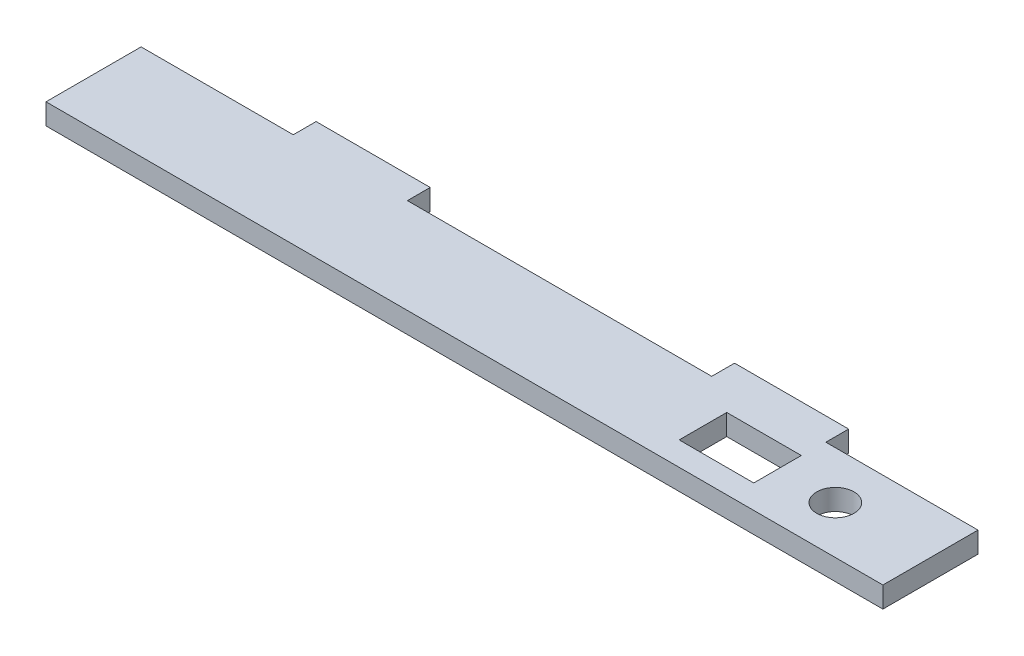
ISO-10303-21;
HEADER;
FILE_DESCRIPTION(('STEP AP214'),'2;1');
FILE_NAME('part.step','',(''),(''),'','','');
FILE_SCHEMA(('AUTOMOTIVE_DESIGN { 1 0 10303 214 1 1 1 1 }'));
ENDSEC;
DATA;
#1=APPLICATION_CONTEXT('core data for automotive mechanical design processes');
#2=APPLICATION_PROTOCOL_DEFINITION('international standard','automotive_design',2000,#1);
#3=PRODUCT_CONTEXT('',#1,'mechanical');
#4=PRODUCT('Part','Part','',(#3));
#5=PRODUCT_RELATED_PRODUCT_CATEGORY('part','',(#4));
#6=PRODUCT_DEFINITION_FORMATION('','',#4);
#7=PRODUCT_DEFINITION_CONTEXT('part definition',#1,'design');
#8=PRODUCT_DEFINITION('design','',#6,#7);
#9=PRODUCT_DEFINITION_SHAPE('','',#8);
#10=(LENGTH_UNIT() NAMED_UNIT(*) SI_UNIT(.MILLI.,.METRE.));
#11=(NAMED_UNIT(*) PLANE_ANGLE_UNIT() SI_UNIT($,.RADIAN.));
#12=(NAMED_UNIT(*) SI_UNIT($,.STERADIAN.) SOLID_ANGLE_UNIT());
#13=UNCERTAINTY_MEASURE_WITH_UNIT(LENGTH_MEASURE(1.E-05),#10,'distance_accuracy_value','');
#14=(GEOMETRIC_REPRESENTATION_CONTEXT(3) GLOBAL_UNCERTAINTY_ASSIGNED_CONTEXT((#13)) GLOBAL_UNIT_ASSIGNED_CONTEXT((#10,
#11,#12)) REPRESENTATION_CONTEXT('',''));
#15=CARTESIAN_POINT('',(0.,0.,0.));
#16=DIRECTION('',(0.,0.,1.));
#17=DIRECTION('',(1.,0.,0.));
#18=AXIS2_PLACEMENT_3D('',#15,#16,#17);
#19=CARTESIAN_POINT('',(-70.,5.5,0.));
#20=DIRECTION('',(-1.,0.,0.));
#21=DIRECTION('',(0.,0.,1.));
#22=AXIS2_PLACEMENT_3D('',#19,#20,#21);
#23=PLANE('',#22);
#24=DIRECTION('',(0.,0.,-1.));
#25=VECTOR('',#24,1.);
#26=CARTESIAN_POINT('',(-70.,0.,0.));
#27=LINE('',#26,#25);
#28=CARTESIAN_POINT('',(-70.,0.,-12.5000000000001));
#29=VERTEX_POINT('',#28);
#30=CARTESIAN_POINT('',(-70.,0.,-18.5000000000001));
#31=VERTEX_POINT('',#30);
#32=EDGE_CURVE('E194',#29,#31,#27,.T.);
#33=ORIENTED_EDGE('',*,*,#32,.F.);
#34=DIRECTION('',(0.,-1.,0.));
#35=VECTOR('',#34,1.);
#36=CARTESIAN_POINT('',(-70.,5.5,-12.5000000000001));
#37=LINE('',#36,#35);
#38=CARTESIAN_POINT('',(-70.,5.5,-12.5000000000001));
#39=VERTEX_POINT('',#38);
#40=EDGE_CURVE('E11',#39,#29,#37,.T.);
#41=ORIENTED_EDGE('',*,*,#40,.F.);
#42=DIRECTION('',(0.,0.,-1.));
#43=VECTOR('',#42,1.);
#44=CARTESIAN_POINT('',(-70.,5.5,0.));
#45=LINE('',#44,#43);
#46=CARTESIAN_POINT('',(-70.,5.5,-18.5000000000001));
#47=VERTEX_POINT('',#46);
#48=EDGE_CURVE('E207',#39,#47,#45,.T.);
#49=ORIENTED_EDGE('',*,*,#48,.T.);
#50=DIRECTION('',(0.,-1.,0.));
#51=VECTOR('',#50,1.);
#52=CARTESIAN_POINT('',(-70.,5.5,-18.5000000000001));
#53=LINE('',#52,#51);
#54=EDGE_CURVE('E245',#47,#31,#53,.T.);
#55=ORIENTED_EDGE('',*,*,#54,.T.);
#56=EDGE_LOOP('',(#33,#41,#49,#55));
#57=FACE_BOUND('',#56,.T.);
#58=ADVANCED_FACE('F38',(#57),#23,.T.);
#59=CARTESIAN_POINT('',(0.,5.5,-12.5000000000001));
#60=DIRECTION('',(0.,0.,-1.));
#61=DIRECTION('',(-1.,0.,0.));
#62=AXIS2_PLACEMENT_3D('',#59,#60,#61);
#63=PLANE('',#62);
#64=DIRECTION('',(1.,0.,0.));
#65=VECTOR('',#64,1.);
#66=CARTESIAN_POINT('',(0.,0.,-12.5000000000001));
#67=LINE('',#66,#65);
#68=CARTESIAN_POINT('',(-110.,0.,-12.5000000000001));
#69=VERTEX_POINT('',#68);
#70=EDGE_CURVE('E249',#69,#29,#67,.T.);
#71=ORIENTED_EDGE('',*,*,#70,.F.);
#72=DIRECTION('',(0.,-1.,0.));
#73=VECTOR('',#72,1.);
#74=CARTESIAN_POINT('',(-110.,5.5,-12.5000000000001));
#75=LINE('',#74,#73);
#76=CARTESIAN_POINT('',(-110.,5.5,-12.5000000000001));
#77=VERTEX_POINT('',#76);
#78=EDGE_CURVE('E46',#77,#69,#75,.T.);
#79=ORIENTED_EDGE('',*,*,#78,.F.);
#80=DIRECTION('',(1.,0.,0.));
#81=VECTOR('',#80,1.);
#82=CARTESIAN_POINT('',(0.,5.5,-12.5000000000001));
#83=LINE('',#82,#81);
#84=EDGE_CURVE('E211',#77,#39,#83,.T.);
#85=ORIENTED_EDGE('',*,*,#84,.T.);
#86=ORIENTED_EDGE('',*,*,#40,.T.);
#87=EDGE_LOOP('',(#71,#79,#85,#86));
#88=FACE_BOUND('',#87,.T.);
#89=ADVANCED_FACE('F322',(#88),#63,.T.);
#90=CARTESIAN_POINT('',(-110.,5.5,0.));
#91=DIRECTION('',(-1.,0.,0.));
#92=DIRECTION('',(0.,0.,1.));
#93=AXIS2_PLACEMENT_3D('',#90,#91,#92);
#94=PLANE('',#93);
#95=DIRECTION('',(0.,0.,-1.));
#96=VECTOR('',#95,1.);
#97=CARTESIAN_POINT('',(-110.,0.,0.));
#98=LINE('',#97,#96);
#99=CARTESIAN_POINT('',(-110.,0.,12.4999999999999));
#100=VERTEX_POINT('',#99);
#101=EDGE_CURVE('E253',#100,#69,#98,.T.);
#102=ORIENTED_EDGE('',*,*,#101,.F.);
#103=DIRECTION('',(0.,-1.,0.));
#104=VECTOR('',#103,1.);
#105=CARTESIAN_POINT('',(-110.,5.5,12.4999999999999));
#106=LINE('',#105,#104);
#107=CARTESIAN_POINT('',(-110.,5.5,12.4999999999999));
#108=VERTEX_POINT('',#107);
#109=EDGE_CURVE('E312',#108,#100,#106,.T.);
#110=ORIENTED_EDGE('',*,*,#109,.F.);
#111=DIRECTION('',(0.,0.,-1.));
#112=VECTOR('',#111,1.);
#113=CARTESIAN_POINT('',(-110.,5.5,0.));
#114=LINE('',#113,#112);
#115=EDGE_CURVE('E216',#108,#77,#114,.T.);
#116=ORIENTED_EDGE('',*,*,#115,.T.);
#117=ORIENTED_EDGE('',*,*,#78,.T.);
#118=EDGE_LOOP('',(#102,#110,#116,#117));
#119=FACE_BOUND('',#118,.T.);
#120=ADVANCED_FACE('F318',(#119),#94,.T.);
#121=CARTESIAN_POINT('',(0.,5.5,12.4999999999999));
#122=DIRECTION('',(0.,0.,-1.));
#123=DIRECTION('',(-1.,0.,0.));
#124=AXIS2_PLACEMENT_3D('',#121,#122,#123);
#125=PLANE('',#124);
#126=DIRECTION('',(1.,0.,0.));
#127=VECTOR('',#126,1.);
#128=CARTESIAN_POINT('',(0.,0.,12.4999999999999));
#129=LINE('',#128,#127);
#130=CARTESIAN_POINT('',(110.000000000001,0.,12.4999999999999));
#131=VERTEX_POINT('',#130);
#132=EDGE_CURVE('E259',#100,#131,#129,.T.);
#133=ORIENTED_EDGE('',*,*,#132,.T.);
#134=DIRECTION('',(0.,-1.,0.));
#135=VECTOR('',#134,1.);
#136=CARTESIAN_POINT('',(110.000000000001,5.5,12.4999999999999));
#137=LINE('',#136,#135);
#138=CARTESIAN_POINT('',(110.000000000001,5.5,12.4999999999999));
#139=VERTEX_POINT('',#138);
#140=EDGE_CURVE('E308',#139,#131,#137,.T.);
#141=ORIENTED_EDGE('',*,*,#140,.F.);
#142=DIRECTION('',(1.,0.,0.));
#143=VECTOR('',#142,1.);
#144=CARTESIAN_POINT('',(0.,5.5,12.4999999999999));
#145=LINE('',#144,#143);
#146=EDGE_CURVE('E222',#108,#139,#145,.T.);
#147=ORIENTED_EDGE('',*,*,#146,.F.);
#148=ORIENTED_EDGE('',*,*,#109,.T.);
#149=EDGE_LOOP('',(#133,#141,#147,#148));
#150=FACE_BOUND('',#149,.T.);
#151=ADVANCED_FACE('F330',(#150),#125,.F.);
#152=CARTESIAN_POINT('',(110.000000000001,5.5,0.));
#153=DIRECTION('',(-1.,0.,0.));
#154=DIRECTION('',(0.,0.,1.));
#155=AXIS2_PLACEMENT_3D('',#152,#153,#154);
#156=PLANE('',#155);
#157=DIRECTION('',(0.,0.,-1.));
#158=VECTOR('',#157,1.);
#159=CARTESIAN_POINT('',(110.000000000001,0.,0.));
#160=LINE('',#159,#158);
#161=CARTESIAN_POINT('',(110.000000000001,0.,-12.5000000000001));
#162=VERTEX_POINT('',#161);
#163=EDGE_CURVE('E262',#131,#162,#160,.T.);
#164=ORIENTED_EDGE('',*,*,#163,.T.);
#165=DIRECTION('',(0.,-1.,0.));
#166=VECTOR('',#165,1.);
#167=CARTESIAN_POINT('',(110.000000000001,5.5,-12.5000000000001));
#168=LINE('',#167,#166);
#169=CARTESIAN_POINT('',(110.000000000001,5.5,-12.5000000000001));
#170=VERTEX_POINT('',#169);
#171=EDGE_CURVE('E305',#170,#162,#168,.T.);
#172=ORIENTED_EDGE('',*,*,#171,.F.);
#173=DIRECTION('',(0.,0.,-1.));
#174=VECTOR('',#173,1.);
#175=CARTESIAN_POINT('',(110.000000000001,5.5,0.));
#176=LINE('',#175,#174);
#177=EDGE_CURVE('E225',#139,#170,#176,.T.);
#178=ORIENTED_EDGE('',*,*,#177,.F.);
#179=ORIENTED_EDGE('',*,*,#140,.T.);
#180=EDGE_LOOP('',(#164,#172,#178,#179));
#181=FACE_BOUND('',#180,.T.);
#182=ADVANCED_FACE('F334',(#181),#156,.F.);
#183=CARTESIAN_POINT('',(70.,0.,-12.5000000000001));
#184=VERTEX_POINT('',#183);
#185=EDGE_CURVE('E255',#184,#162,#67,.T.);
#186=ORIENTED_EDGE('',*,*,#185,.F.);
#187=DIRECTION('',(0.,-1.,0.));
#188=VECTOR('',#187,1.);
#189=CARTESIAN_POINT('',(70.,5.5,-12.5000000000001));
#190=LINE('',#189,#188);
#191=CARTESIAN_POINT('',(70.,5.5,-12.5000000000001));
#192=VERTEX_POINT('',#191);
#193=EDGE_CURVE('E302',#192,#184,#190,.T.);
#194=ORIENTED_EDGE('',*,*,#193,.F.);
#195=EDGE_CURVE('E218',#192,#170,#83,.T.);
#196=ORIENTED_EDGE('',*,*,#195,.T.);
#197=ORIENTED_EDGE('',*,*,#171,.T.);
#198=EDGE_LOOP('',(#186,#194,#196,#197));
#199=FACE_BOUND('',#198,.T.);
#200=ADVANCED_FACE('F363',(#199),#63,.T.);
#201=CARTESIAN_POINT('',(70.,5.5,0.));
#202=DIRECTION('',(-1.,0.,0.));
#203=DIRECTION('',(0.,0.,1.));
#204=AXIS2_PLACEMENT_3D('',#201,#202,#203);
#205=PLANE('',#204);
#206=DIRECTION('',(0.,0.,-1.));
#207=VECTOR('',#206,1.);
#208=CARTESIAN_POINT('',(70.,0.,0.));
#209=LINE('',#208,#207);
#210=CARTESIAN_POINT('',(70.,0.,-18.5000000000001));
#211=VERTEX_POINT('',#210);
#212=EDGE_CURVE('E266',#184,#211,#209,.T.);
#213=ORIENTED_EDGE('',*,*,#212,.T.);
#214=DIRECTION('',(0.,-1.,0.));
#215=VECTOR('',#214,1.);
#216=CARTESIAN_POINT('',(70.,5.5,-18.5000000000001));
#217=LINE('',#216,#215);
#218=CARTESIAN_POINT('',(70.,5.5,-18.5000000000001));
#219=VERTEX_POINT('',#218);
#220=EDGE_CURVE('E298',#219,#211,#217,.T.);
#221=ORIENTED_EDGE('',*,*,#220,.F.);
#222=DIRECTION('',(0.,0.,-1.));
#223=VECTOR('',#222,1.);
#224=CARTESIAN_POINT('',(70.,5.5,0.));
#225=LINE('',#224,#223);
#226=EDGE_CURVE('E228',#192,#219,#225,.T.);
#227=ORIENTED_EDGE('',*,*,#226,.F.);
#228=ORIENTED_EDGE('',*,*,#193,.T.);
#229=EDGE_LOOP('',(#213,#221,#227,#228));
#230=FACE_BOUND('',#229,.T.);
#231=ADVANCED_FACE('F377',(#230),#205,.F.);
#232=CARTESIAN_POINT('',(0.,5.5,-18.5000000000001));
#233=DIRECTION('',(0.,0.,1.));
#234=DIRECTION('',(1.,0.,0.));
#235=AXIS2_PLACEMENT_3D('',#232,#233,#234);
#236=PLANE('',#235);
#237=DIRECTION('',(-1.,0.,0.));
#238=VECTOR('',#237,1.);
#239=CARTESIAN_POINT('',(0.,0.,-18.5000000000001));
#240=LINE('',#239,#238);
#241=CARTESIAN_POINT('',(40.,0.,-18.5000000000001));
#242=VERTEX_POINT('',#241);
#243=EDGE_CURVE('E269',#211,#242,#240,.T.);
#244=ORIENTED_EDGE('',*,*,#243,.T.);
#245=DIRECTION('',(0.,-1.,0.));
#246=VECTOR('',#245,1.);
#247=CARTESIAN_POINT('',(40.,5.5,-18.5000000000001));
#248=LINE('',#247,#246);
#249=CARTESIAN_POINT('',(40.,5.5,-18.5000000000001));
#250=VERTEX_POINT('',#249);
#251=EDGE_CURVE('E295',#250,#242,#248,.T.);
#252=ORIENTED_EDGE('',*,*,#251,.F.);
#253=DIRECTION('',(-1.,0.,0.));
#254=VECTOR('',#253,1.);
#255=CARTESIAN_POINT('',(0.,5.5,-18.5000000000001));
#256=LINE('',#255,#254);
#257=EDGE_CURVE('E231',#219,#250,#256,.T.);
#258=ORIENTED_EDGE('',*,*,#257,.F.);
#259=ORIENTED_EDGE('',*,*,#220,.T.);
#260=EDGE_LOOP('',(#244,#252,#258,#259));
#261=FACE_BOUND('',#260,.T.);
#262=ADVANCED_FACE('F374',(#261),#236,.F.);
#263=CARTESIAN_POINT('',(40.,5.5,0.));
#264=DIRECTION('',(-1.,0.,0.));
#265=DIRECTION('',(0.,0.,1.));
#266=AXIS2_PLACEMENT_3D('',#263,#264,#265);
#267=PLANE('',#266);
#268=DIRECTION('',(0.,0.,-1.));
#269=VECTOR('',#268,1.);
#270=CARTESIAN_POINT('',(40.,0.,0.));
#271=LINE('',#270,#269);
#272=CARTESIAN_POINT('',(40.,0.,-12.5000000000001));
#273=VERTEX_POINT('',#272);
#274=EDGE_CURVE('E273',#273,#242,#271,.T.);
#275=ORIENTED_EDGE('',*,*,#274,.F.);
#276=DIRECTION('',(0.,-1.,0.));
#277=VECTOR('',#276,1.);
#278=CARTESIAN_POINT('',(40.,5.5,-12.5000000000001));
#279=LINE('',#278,#277);
#280=CARTESIAN_POINT('',(40.,5.5,-12.5000000000001));
#281=VERTEX_POINT('',#280);
#282=EDGE_CURVE('E292',#281,#273,#279,.T.);
#283=ORIENTED_EDGE('',*,*,#282,.F.);
#284=DIRECTION('',(0.,0.,-1.));
#285=VECTOR('',#284,1.);
#286=CARTESIAN_POINT('',(40.,5.5,0.));
#287=LINE('',#286,#285);
#288=EDGE_CURVE('E234',#281,#250,#287,.T.);
#289=ORIENTED_EDGE('',*,*,#288,.T.);
#290=ORIENTED_EDGE('',*,*,#251,.T.);
#291=EDGE_LOOP('',(#275,#283,#289,#290));
#292=FACE_BOUND('',#291,.T.);
#293=ADVANCED_FACE('F372',(#292),#267,.T.);
#294=CARTESIAN_POINT('',(-40.,0.,-12.5000000000001));
#295=VERTEX_POINT('',#294);
#296=EDGE_CURVE('E254',#295,#273,#67,.T.);
#297=ORIENTED_EDGE('',*,*,#296,.F.);
#298=DIRECTION('',(0.,-1.,0.));
#299=VECTOR('',#298,1.);
#300=CARTESIAN_POINT('',(-40.,5.5,-12.5000000000001));
#301=LINE('',#300,#299);
#302=CARTESIAN_POINT('',(-40.,5.5,-12.5000000000001));
#303=VERTEX_POINT('',#302);
#304=EDGE_CURVE('E289',#303,#295,#301,.T.);
#305=ORIENTED_EDGE('',*,*,#304,.F.);
#306=EDGE_CURVE('E217',#303,#281,#83,.T.);
#307=ORIENTED_EDGE('',*,*,#306,.T.);
#308=ORIENTED_EDGE('',*,*,#282,.T.);
#309=EDGE_LOOP('',(#297,#305,#307,#308));
#310=FACE_BOUND('',#309,.T.);
#311=ADVANCED_FACE('F354',(#310),#63,.T.);
#312=CARTESIAN_POINT('',(-40.,5.5,0.));
#313=DIRECTION('',(-1.,0.,0.));
#314=DIRECTION('',(0.,0.,1.));
#315=AXIS2_PLACEMENT_3D('',#312,#313,#314);
#316=PLANE('',#315);
#317=DIRECTION('',(0.,0.,-1.));
#318=VECTOR('',#317,1.);
#319=CARTESIAN_POINT('',(-40.,0.,0.));
#320=LINE('',#319,#318);
#321=CARTESIAN_POINT('',(-40.,0.,-18.5000000000001));
#322=VERTEX_POINT('',#321);
#323=EDGE_CURVE('E277',#295,#322,#320,.T.);
#324=ORIENTED_EDGE('',*,*,#323,.T.);
#325=DIRECTION('',(0.,-1.,0.));
#326=VECTOR('',#325,1.);
#327=CARTESIAN_POINT('',(-40.,5.5,-18.5000000000001));
#328=LINE('',#327,#326);
#329=CARTESIAN_POINT('',(-40.,5.5,-18.5000000000001));
#330=VERTEX_POINT('',#329);
#331=EDGE_CURVE('E286',#330,#322,#328,.T.);
#332=ORIENTED_EDGE('',*,*,#331,.F.);
#333=DIRECTION('',(0.,0.,-1.));
#334=VECTOR('',#333,1.);
#335=CARTESIAN_POINT('',(-40.,5.5,0.));
#336=LINE('',#335,#334);
#337=EDGE_CURVE('E238',#303,#330,#336,.T.);
#338=ORIENTED_EDGE('',*,*,#337,.F.);
#339=ORIENTED_EDGE('',*,*,#304,.T.);
#340=EDGE_LOOP('',(#324,#332,#338,#339));
#341=FACE_BOUND('',#340,.T.);
#342=ADVANCED_FACE('F350',(#341),#316,.F.);
#343=CARTESIAN_POINT('',(0.,5.5,-18.5000000000001));
#344=DIRECTION('',(0.,0.,-1.));
#345=DIRECTION('',(-1.,0.,0.));
#346=AXIS2_PLACEMENT_3D('',#343,#344,#345);
#347=PLANE('',#346);
#348=DIRECTION('',(1.,0.,0.));
#349=VECTOR('',#348,1.);
#350=CARTESIAN_POINT('',(0.,0.,-18.5000000000001));
#351=LINE('',#350,#349);
#352=EDGE_CURVE('E212',#31,#322,#351,.T.);
#353=ORIENTED_EDGE('',*,*,#352,.F.);
#354=ORIENTED_EDGE('',*,*,#54,.F.);
#355=DIRECTION('',(1.,0.,0.));
#356=VECTOR('',#355,1.);
#357=CARTESIAN_POINT('',(0.,5.5,-18.5000000000001));
#358=LINE('',#357,#356);
#359=EDGE_CURVE('E241',#47,#330,#358,.T.);
#360=ORIENTED_EDGE('',*,*,#359,.T.);
#361=ORIENTED_EDGE('',*,*,#331,.T.);
#362=EDGE_LOOP('',(#353,#354,#360,#361));
#363=FACE_BOUND('',#362,.T.);
#364=ADVANCED_FACE('F346',(#363),#347,.T.);
#365=CARTESIAN_POINT('',(0.,5.5,0.));
#366=DIRECTION('',(0.,1.,0.));
#367=DIRECTION('',(0.,0.,1.));
#368=AXIS2_PLACEMENT_3D('',#365,#366,#367);
#369=PLANE('',#368);
#370=DIRECTION('',(0.,0.,-1.));
#371=VECTOR('',#370,1.);
#372=CARTESIAN_POINT('',(69.8000000000006,5.5,6.25));
#373=LINE('',#372,#371);
#374=CARTESIAN_POINT('',(69.8000000000006,5.5,6.25));
#375=VERTEX_POINT('',#374);
#376=CARTESIAN_POINT('',(69.8000000000006,5.5,-6.25));
#377=VERTEX_POINT('',#376);
#378=EDGE_CURVE('E53',#375,#377,#373,.T.);
#379=ORIENTED_EDGE('',*,*,#378,.F.);
#380=DIRECTION('',(1.,0.,0.));
#381=VECTOR('',#380,1.);
#382=CARTESIAN_POINT('',(50.2000000000005,5.5,6.25));
#383=LINE('',#382,#381);
#384=CARTESIAN_POINT('',(50.2000000000005,5.5,6.25));
#385=VERTEX_POINT('',#384);
#386=EDGE_CURVE('E171',#385,#375,#383,.T.);
#387=ORIENTED_EDGE('',*,*,#386,.F.);
#388=DIRECTION('',(0.,0.,1.));
#389=VECTOR('',#388,1.);
#390=CARTESIAN_POINT('',(50.2000000000005,5.5,6.25));
#391=LINE('',#390,#389);
#392=CARTESIAN_POINT('',(50.2000000000005,5.5,-6.25));
#393=VERTEX_POINT('',#392);
#394=EDGE_CURVE('E175',#393,#385,#391,.T.);
#395=ORIENTED_EDGE('',*,*,#394,.F.);
#396=DIRECTION('',(-1.,0.,0.));
#397=VECTOR('',#396,1.);
#398=CARTESIAN_POINT('',(50.2000000000005,5.5,-6.25));
#399=LINE('',#398,#397);
#400=EDGE_CURVE('E184',#377,#393,#399,.T.);
#401=ORIENTED_EDGE('',*,*,#400,.F.);
#402=EDGE_LOOP('',(#379,#387,#395,#401));
#403=FACE_BOUND('',#402,.T.);
#404=CARTESIAN_POINT('',(85.0000000000006,5.5,0.));
#405=DIRECTION('',(0.,1.,0.));
#406=DIRECTION('',(0.,0.,1.));
#407=AXIS2_PLACEMENT_3D('',#404,#405,#406);
#408=CIRCLE('',#407,4.9);
#409=CARTESIAN_POINT('',(85.0000000000006,5.5,4.9));
#410=VERTEX_POINT('',#409);
#411=EDGE_CURVE('E203',#410,#410,#408,.T.);
#412=ORIENTED_EDGE('',*,*,#411,.F.);
#413=EDGE_LOOP('',(#412));
#414=FACE_BOUND('',#413,.T.);
#415=ORIENTED_EDGE('',*,*,#48,.F.);
#416=ORIENTED_EDGE('',*,*,#84,.F.);
#417=ORIENTED_EDGE('',*,*,#115,.F.);
#418=ORIENTED_EDGE('',*,*,#146,.T.);
#419=ORIENTED_EDGE('',*,*,#177,.T.);
#420=ORIENTED_EDGE('',*,*,#195,.F.);
#421=ORIENTED_EDGE('',*,*,#226,.T.);
#422=ORIENTED_EDGE('',*,*,#257,.T.);
#423=ORIENTED_EDGE('',*,*,#288,.F.);
#424=ORIENTED_EDGE('',*,*,#306,.F.);
#425=ORIENTED_EDGE('',*,*,#337,.T.);
#426=ORIENTED_EDGE('',*,*,#359,.F.);
#427=EDGE_LOOP('',(#415,#416,#417,#418,#419,#420,#421,#422,#423,#424,#425,#426));
#428=FACE_BOUND('',#427,.T.);
#429=ADVANCED_FACE('F340',(#403,#414,#428),#369,.T.);
#430=CARTESIAN_POINT('',(0.,0.,0.));
#431=DIRECTION('',(0.,1.,0.));
#432=DIRECTION('',(0.,0.,1.));
#433=AXIS2_PLACEMENT_3D('',#430,#431,#432);
#434=PLANE('',#433);
#435=DIRECTION('',(1.,0.,0.));
#436=VECTOR('',#435,1.);
#437=CARTESIAN_POINT('',(50.2000000000005,0.,6.25));
#438=LINE('',#437,#436);
#439=CARTESIAN_POINT('',(50.2000000000005,0.,6.25));
#440=VERTEX_POINT('',#439);
#441=CARTESIAN_POINT('',(69.8000000000006,0.,6.25));
#442=VERTEX_POINT('',#441);
#443=EDGE_CURVE('E159',#440,#442,#438,.T.);
#444=ORIENTED_EDGE('',*,*,#443,.T.);
#445=DIRECTION('',(0.,0.,-1.));
#446=VECTOR('',#445,1.);
#447=CARTESIAN_POINT('',(69.8000000000006,0.,6.25));
#448=LINE('',#447,#446);
#449=CARTESIAN_POINT('',(69.8000000000006,0.,-6.25));
#450=VERTEX_POINT('',#449);
#451=EDGE_CURVE('E152',#442,#450,#448,.T.);
#452=ORIENTED_EDGE('',*,*,#451,.T.);
#453=DIRECTION('',(-1.,0.,0.));
#454=VECTOR('',#453,1.);
#455=CARTESIAN_POINT('',(50.2000000000005,0.,-6.25));
#456=LINE('',#455,#454);
#457=CARTESIAN_POINT('',(50.2000000000005,0.,-6.25));
#458=VERTEX_POINT('',#457);
#459=EDGE_CURVE('E162',#450,#458,#456,.T.);
#460=ORIENTED_EDGE('',*,*,#459,.T.);
#461=DIRECTION('',(0.,0.,1.));
#462=VECTOR('',#461,1.);
#463=CARTESIAN_POINT('',(50.2000000000005,0.,6.25));
#464=LINE('',#463,#462);
#465=EDGE_CURVE('E61',#458,#440,#464,.T.);
#466=ORIENTED_EDGE('',*,*,#465,.T.);
#467=EDGE_LOOP('',(#444,#452,#460,#466));
#468=FACE_BOUND('',#467,.T.);
#469=CARTESIAN_POINT('',(85.0000000000006,0.,0.));
#470=DIRECTION('',(0.,1.,0.));
#471=DIRECTION('',(0.,0.,1.));
#472=AXIS2_PLACEMENT_3D('',#469,#470,#471);
#473=CIRCLE('',#472,4.9);
#474=CARTESIAN_POINT('',(85.0000000000006,0.,4.9));
#475=VERTEX_POINT('',#474);
#476=EDGE_CURVE('E185',#475,#475,#473,.T.);
#477=ORIENTED_EDGE('',*,*,#476,.T.);
#478=EDGE_LOOP('',(#477));
#479=FACE_BOUND('',#478,.T.);
#480=ORIENTED_EDGE('',*,*,#32,.T.);
#481=ORIENTED_EDGE('',*,*,#352,.T.);
#482=ORIENTED_EDGE('',*,*,#323,.F.);
#483=ORIENTED_EDGE('',*,*,#296,.T.);
#484=ORIENTED_EDGE('',*,*,#274,.T.);
#485=ORIENTED_EDGE('',*,*,#243,.F.);
#486=ORIENTED_EDGE('',*,*,#212,.F.);
#487=ORIENTED_EDGE('',*,*,#185,.T.);
#488=ORIENTED_EDGE('',*,*,#163,.F.);
#489=ORIENTED_EDGE('',*,*,#132,.F.);
#490=ORIENTED_EDGE('',*,*,#101,.T.);
#491=ORIENTED_EDGE('',*,*,#70,.T.);
#492=EDGE_LOOP('',(#480,#481,#482,#483,#484,#485,#486,#487,#488,#489,#490,#491));
#493=FACE_BOUND('',#492,.T.);
#494=ADVANCED_FACE('F167',(#468,#479,#493),#434,.F.);
#495=CARTESIAN_POINT('',(85.0000000000006,0.,0.));
#496=DIRECTION('',(0.,1.,0.));
#497=DIRECTION('',(0.,0.,1.));
#498=AXIS2_PLACEMENT_3D('',#495,#496,#497);
#499=CYLINDRICAL_SURFACE('',#498,4.9);
#500=ORIENTED_EDGE('',*,*,#476,.F.);
#501=EDGE_LOOP('',(#500));
#502=FACE_BOUND('',#501,.T.);
#503=ORIENTED_EDGE('',*,*,#411,.T.);
#504=EDGE_LOOP('',(#503));
#505=FACE_BOUND('',#504,.T.);
#506=ADVANCED_FACE('F497',(#502,#505),#499,.F.);
#507=CARTESIAN_POINT('',(69.8000000000006,0.,6.25));
#508=DIRECTION('',(1.,0.,0.));
#509=DIRECTION('',(0.,0.,-1.));
#510=AXIS2_PLACEMENT_3D('',#507,#508,#509);
#511=PLANE('',#510);
#512=ORIENTED_EDGE('',*,*,#378,.T.);
#513=DIRECTION('',(0.,1.,0.));
#514=VECTOR('',#513,1.);
#515=CARTESIAN_POINT('',(69.8000000000006,0.,-6.25));
#516=LINE('',#515,#514);
#517=EDGE_CURVE('E148',#450,#377,#516,.T.);
#518=ORIENTED_EDGE('',*,*,#517,.F.);
#519=ORIENTED_EDGE('',*,*,#451,.F.);
#520=DIRECTION('',(0.,1.,0.));
#521=VECTOR('',#520,1.);
#522=CARTESIAN_POINT('',(69.8000000000006,0.,6.25));
#523=LINE('',#522,#521);
#524=EDGE_CURVE('E191',#442,#375,#523,.T.);
#525=ORIENTED_EDGE('',*,*,#524,.T.);
#526=EDGE_LOOP('',(#512,#518,#519,#525));
#527=FACE_BOUND('',#526,.T.);
#528=ADVANCED_FACE('F150',(#527),#511,.F.);
#529=CARTESIAN_POINT('',(50.2000000000005,0.,6.25));
#530=DIRECTION('',(0.,0.,1.));
#531=DIRECTION('',(1.,0.,0.));
#532=AXIS2_PLACEMENT_3D('',#529,#530,#531);
#533=PLANE('',#532);
#534=ORIENTED_EDGE('',*,*,#386,.T.);
#535=ORIENTED_EDGE('',*,*,#524,.F.);
#536=ORIENTED_EDGE('',*,*,#443,.F.);
#537=DIRECTION('',(0.,1.,0.));
#538=VECTOR('',#537,1.);
#539=CARTESIAN_POINT('',(50.2000000000005,0.,6.25));
#540=LINE('',#539,#538);
#541=EDGE_CURVE('E195',#440,#385,#540,.T.);
#542=ORIENTED_EDGE('',*,*,#541,.T.);
#543=EDGE_LOOP('',(#534,#535,#536,#542));
#544=FACE_BOUND('',#543,.T.);
#545=ADVANCED_FACE('F519',(#544),#533,.F.);
#546=CARTESIAN_POINT('',(50.2000000000005,0.,6.25));
#547=DIRECTION('',(-1.,0.,0.));
#548=DIRECTION('',(0.,0.,1.));
#549=AXIS2_PLACEMENT_3D('',#546,#547,#548);
#550=PLANE('',#549);
#551=ORIENTED_EDGE('',*,*,#394,.T.);
#552=ORIENTED_EDGE('',*,*,#541,.F.);
#553=ORIENTED_EDGE('',*,*,#465,.F.);
#554=DIRECTION('',(0.,1.,0.));
#555=VECTOR('',#554,1.);
#556=CARTESIAN_POINT('',(50.2000000000005,0.,-6.25));
#557=LINE('',#556,#555);
#558=EDGE_CURVE('E158',#458,#393,#557,.T.);
#559=ORIENTED_EDGE('',*,*,#558,.T.);
#560=EDGE_LOOP('',(#551,#552,#553,#559));
#561=FACE_BOUND('',#560,.T.);
#562=ADVANCED_FACE('F527',(#561),#550,.F.);
#563=CARTESIAN_POINT('',(50.2000000000005,0.,-6.25));
#564=DIRECTION('',(0.,0.,-1.));
#565=DIRECTION('',(-1.,0.,0.));
#566=AXIS2_PLACEMENT_3D('',#563,#564,#565);
#567=PLANE('',#566);
#568=ORIENTED_EDGE('',*,*,#400,.T.);
#569=ORIENTED_EDGE('',*,*,#558,.F.);
#570=ORIENTED_EDGE('',*,*,#459,.F.);
#571=ORIENTED_EDGE('',*,*,#517,.T.);
#572=EDGE_LOOP('',(#568,#569,#570,#571));
#573=FACE_BOUND('',#572,.T.);
#574=ADVANCED_FACE('F163',(#573),#567,.F.);
#575=CLOSED_SHELL('',(#58,#89,#120,#151,#182,#200,#231,#262,#293,#311,#342,#364,#429,#494,#506,
#528,#545,#562,#574));
#576=MANIFOLD_SOLID_BREP('B2',#575);
#577=ADVANCED_BREP_SHAPE_REPRESENTATION('',(#18,#576),#14);
#578=SHAPE_DEFINITION_REPRESENTATION(#9,#577);
ENDSEC;
END-ISO-10303-21;
